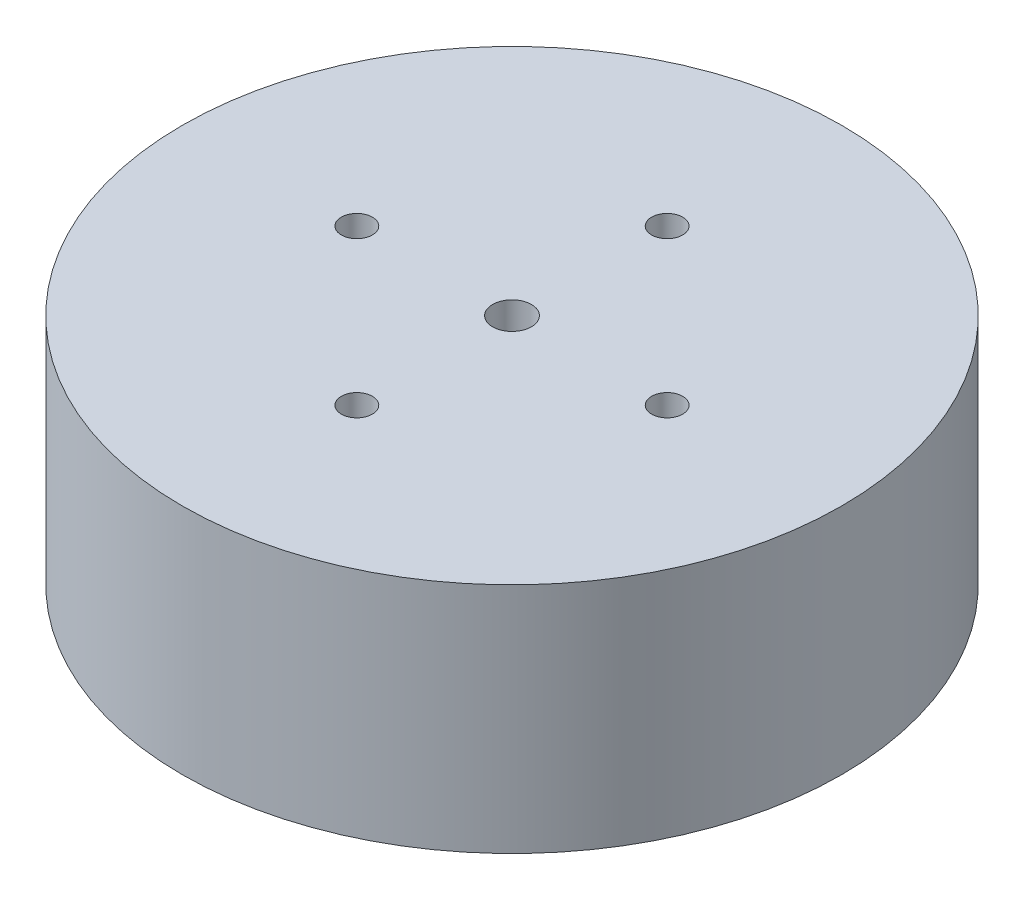
ISO-10303-21;
HEADER;
FILE_DESCRIPTION(('STEP AP214'),'2;1');
FILE_NAME('part.step','',(''),(''),'','','');
FILE_SCHEMA(('AUTOMOTIVE_DESIGN { 1 0 10303 214 1 1 1 1 }'));
ENDSEC;
DATA;
#1=APPLICATION_CONTEXT('core data for automotive mechanical design processes');
#2=APPLICATION_PROTOCOL_DEFINITION('international standard','automotive_design',2000,#1);
#3=PRODUCT_CONTEXT('',#1,'mechanical');
#4=PRODUCT('Part','Part','',(#3));
#5=PRODUCT_RELATED_PRODUCT_CATEGORY('part','',(#4));
#6=PRODUCT_DEFINITION_FORMATION('','',#4);
#7=PRODUCT_DEFINITION_CONTEXT('part definition',#1,'design');
#8=PRODUCT_DEFINITION('design','',#6,#7);
#9=PRODUCT_DEFINITION_SHAPE('','',#8);
#10=(LENGTH_UNIT() NAMED_UNIT(*) SI_UNIT(.MILLI.,.METRE.));
#11=(NAMED_UNIT(*) PLANE_ANGLE_UNIT() SI_UNIT($,.RADIAN.));
#12=(NAMED_UNIT(*) SI_UNIT($,.STERADIAN.) SOLID_ANGLE_UNIT());
#13=UNCERTAINTY_MEASURE_WITH_UNIT(LENGTH_MEASURE(1.E-05),#10,'distance_accuracy_value','');
#14=(GEOMETRIC_REPRESENTATION_CONTEXT(3) GLOBAL_UNCERTAINTY_ASSIGNED_CONTEXT((#13)) GLOBAL_UNIT_ASSIGNED_CONTEXT((#10,
#11,#12)) REPRESENTATION_CONTEXT('',''));
#15=CARTESIAN_POINT('',(0.,0.,0.));
#16=DIRECTION('',(0.,0.,1.));
#17=DIRECTION('',(1.,0.,0.));
#18=AXIS2_PLACEMENT_3D('',#15,#16,#17);
#19=CARTESIAN_POINT('',(0.,30.,0.));
#20=DIRECTION('',(0.,-1.,0.));
#21=DIRECTION('',(0.,0.,-1.));
#22=AXIS2_PLACEMENT_3D('',#19,#20,#21);
#23=CYLINDRICAL_SURFACE('',#22,42.5);
#24=CARTESIAN_POINT('',(0.,30.,0.));
#25=DIRECTION('',(0.,1.,0.));
#26=DIRECTION('',(0.,0.,1.));
#27=AXIS2_PLACEMENT_3D('',#24,#25,#26);
#28=CIRCLE('',#27,42.5);
#29=CARTESIAN_POINT('',(0.,30.,42.5));
#30=VERTEX_POINT('',#29);
#31=EDGE_CURVE('E10',#30,#30,#28,.T.);
#32=ORIENTED_EDGE('',*,*,#31,.F.);
#33=EDGE_LOOP('',(#32));
#34=FACE_BOUND('',#33,.T.);
#35=CARTESIAN_POINT('',(0.,0.,0.));
#36=DIRECTION('',(0.,1.,0.));
#37=DIRECTION('',(0.,0.,1.));
#38=AXIS2_PLACEMENT_3D('',#35,#36,#37);
#39=CIRCLE('',#38,42.5);
#40=CARTESIAN_POINT('',(0.,0.,42.5));
#41=VERTEX_POINT('',#40);
#42=EDGE_CURVE('E42',#41,#41,#39,.T.);
#43=ORIENTED_EDGE('',*,*,#42,.T.);
#44=EDGE_LOOP('',(#43));
#45=FACE_BOUND('',#44,.T.);
#46=ADVANCED_FACE('F39',(#34,#45),#23,.T.);
#47=CARTESIAN_POINT('',(0.,30.,0.));
#48=DIRECTION('',(0.,1.,0.));
#49=DIRECTION('',(0.,0.,1.));
#50=AXIS2_PLACEMENT_3D('',#47,#48,#49);
#51=PLANE('',#50);
#52=CARTESIAN_POINT('',(0.,30.,20.));
#53=DIRECTION('',(0.,-1.,0.));
#54=DIRECTION('',(0.,0.,-1.));
#55=AXIS2_PLACEMENT_3D('',#52,#53,#54);
#56=CIRCLE('',#55,2.);
#57=CARTESIAN_POINT('',(0.,30.,18.));
#58=VERTEX_POINT('',#57);
#59=EDGE_CURVE('E65',#58,#58,#56,.T.);
#60=ORIENTED_EDGE('',*,*,#59,.T.);
#61=EDGE_LOOP('',(#60));
#62=FACE_BOUND('',#61,.T.);
#63=CARTESIAN_POINT('',(-20.,30.,0.));
#64=DIRECTION('',(0.,-1.,0.));
#65=DIRECTION('',(0.,0.,-1.));
#66=AXIS2_PLACEMENT_3D('',#63,#64,#65);
#67=CIRCLE('',#66,2.);
#68=CARTESIAN_POINT('',(-20.,30.,-2.));
#69=VERTEX_POINT('',#68);
#70=EDGE_CURVE('E89',#69,#69,#67,.T.);
#71=ORIENTED_EDGE('',*,*,#70,.T.);
#72=EDGE_LOOP('',(#71));
#73=FACE_BOUND('',#72,.T.);
#74=CARTESIAN_POINT('',(0.,30.,-20.));
#75=DIRECTION('',(0.,-1.,0.));
#76=DIRECTION('',(0.,0.,-1.));
#77=AXIS2_PLACEMENT_3D('',#74,#75,#76);
#78=CIRCLE('',#77,2.);
#79=CARTESIAN_POINT('',(0.,30.,-22.));
#80=VERTEX_POINT('',#79);
#81=EDGE_CURVE('E81',#80,#80,#78,.T.);
#82=ORIENTED_EDGE('',*,*,#81,.T.);
#83=EDGE_LOOP('',(#82));
#84=FACE_BOUND('',#83,.T.);
#85=CARTESIAN_POINT('',(20.,30.,0.));
#86=DIRECTION('',(0.,-1.,0.));
#87=DIRECTION('',(0.,0.,-1.));
#88=AXIS2_PLACEMENT_3D('',#85,#86,#87);
#89=CIRCLE('',#88,2.);
#90=CARTESIAN_POINT('',(20.,30.,-2.));
#91=VERTEX_POINT('',#90);
#92=EDGE_CURVE('E73',#91,#91,#89,.T.);
#93=ORIENTED_EDGE('',*,*,#92,.T.);
#94=EDGE_LOOP('',(#93));
#95=FACE_BOUND('',#94,.T.);
#96=CARTESIAN_POINT('',(0.,30.,0.));
#97=DIRECTION('',(0.,1.,0.));
#98=DIRECTION('',(0.,0.,1.));
#99=AXIS2_PLACEMENT_3D('',#96,#97,#98);
#100=CIRCLE('',#99,2.5);
#101=CARTESIAN_POINT('',(0.,30.,2.5));
#102=VERTEX_POINT('',#101);
#103=EDGE_CURVE('E53',#102,#102,#100,.T.);
#104=ORIENTED_EDGE('',*,*,#103,.F.);
#105=EDGE_LOOP('',(#104));
#106=FACE_BOUND('',#105,.T.);
#107=ORIENTED_EDGE('',*,*,#31,.T.);
#108=EDGE_LOOP('',(#107));
#109=FACE_BOUND('',#108,.T.);
#110=ADVANCED_FACE('F101',(#62,#73,#84,#95,#106,#109),#51,.T.);
#111=CARTESIAN_POINT('',(0.,0.,0.));
#112=DIRECTION('',(0.,1.,0.));
#113=DIRECTION('',(0.,0.,1.));
#114=AXIS2_PLACEMENT_3D('',#111,#112,#113);
#115=PLANE('',#114);
#116=CARTESIAN_POINT('',(0.,0.,0.));
#117=DIRECTION('',(0.,-1.,0.));
#118=DIRECTION('',(0.,0.,-1.));
#119=AXIS2_PLACEMENT_3D('',#116,#117,#118);
#120=CIRCLE('',#119,27.5);
#121=CARTESIAN_POINT('',(0.,0.,-27.5));
#122=VERTEX_POINT('',#121);
#123=EDGE_CURVE('E61',#122,#122,#120,.T.);
#124=ORIENTED_EDGE('',*,*,#123,.F.);
#125=EDGE_LOOP('',(#124));
#126=FACE_BOUND('',#125,.T.);
#127=ORIENTED_EDGE('',*,*,#42,.F.);
#128=EDGE_LOOP('',(#127));
#129=FACE_BOUND('',#128,.T.);
#130=ADVANCED_FACE('F131',(#126,#129),#115,.F.);
#131=CARTESIAN_POINT('',(0.,20.,0.));
#132=DIRECTION('',(0.,1.,0.));
#133=DIRECTION('',(0.,0.,1.));
#134=AXIS2_PLACEMENT_3D('',#131,#132,#133);
#135=CYLINDRICAL_SURFACE('',#134,2.5);
#136=CARTESIAN_POINT('',(0.,20.,0.));
#137=DIRECTION('',(0.,1.,0.));
#138=DIRECTION('',(0.,0.,1.));
#139=AXIS2_PLACEMENT_3D('',#136,#137,#138);
#140=CIRCLE('',#139,2.5);
#141=CARTESIAN_POINT('',(0.,20.,2.5));
#142=VERTEX_POINT('',#141);
#143=EDGE_CURVE('E51',#142,#142,#140,.T.);
#144=ORIENTED_EDGE('',*,*,#143,.F.);
#145=EDGE_LOOP('',(#144));
#146=FACE_BOUND('',#145,.T.);
#147=ORIENTED_EDGE('',*,*,#103,.T.);
#148=EDGE_LOOP('',(#147));
#149=FACE_BOUND('',#148,.T.);
#150=ADVANCED_FACE('F134',(#146,#149),#135,.F.);
#151=CARTESIAN_POINT('',(0.,20.,0.));
#152=DIRECTION('',(0.,1.,0.));
#153=DIRECTION('',(0.,0.,1.));
#154=AXIS2_PLACEMENT_3D('',#151,#152,#153);
#155=PLANE('',#154);
#156=ORIENTED_EDGE('',*,*,#143,.T.);
#157=EDGE_LOOP('',(#156));
#158=FACE_BOUND('',#157,.T.);
#159=ADVANCED_FACE('F127',(#158),#155,.T.);
#160=CARTESIAN_POINT('',(0.,5.,0.));
#161=DIRECTION('',(0.,-1.,0.));
#162=DIRECTION('',(0.,0.,-1.));
#163=AXIS2_PLACEMENT_3D('',#160,#161,#162);
#164=CYLINDRICAL_SURFACE('',#163,27.5);
#165=CARTESIAN_POINT('',(0.,5.,0.));
#166=DIRECTION('',(0.,-1.,0.));
#167=DIRECTION('',(0.,0.,-1.));
#168=AXIS2_PLACEMENT_3D('',#165,#166,#167);
#169=CIRCLE('',#168,27.5);
#170=CARTESIAN_POINT('',(0.,5.,-27.5));
#171=VERTEX_POINT('',#170);
#172=EDGE_CURVE('E57',#171,#171,#169,.T.);
#173=ORIENTED_EDGE('',*,*,#172,.F.);
#174=EDGE_LOOP('',(#173));
#175=FACE_BOUND('',#174,.T.);
#176=ORIENTED_EDGE('',*,*,#123,.T.);
#177=EDGE_LOOP('',(#176));
#178=FACE_BOUND('',#177,.T.);
#179=ADVANCED_FACE('F115',(#175,#178),#164,.F.);
#180=CARTESIAN_POINT('',(0.,5.,0.));
#181=DIRECTION('',(0.,-1.,0.));
#182=DIRECTION('',(0.,0.,-1.));
#183=AXIS2_PLACEMENT_3D('',#180,#181,#182);
#184=PLANE('',#183);
#185=CARTESIAN_POINT('',(0.,5.,20.));
#186=DIRECTION('',(0.,-1.,0.));
#187=DIRECTION('',(0.,0.,-1.));
#188=AXIS2_PLACEMENT_3D('',#185,#186,#187);
#189=CIRCLE('',#188,2.);
#190=CARTESIAN_POINT('',(0.,5.,18.));
#191=VERTEX_POINT('',#190);
#192=EDGE_CURVE('E93',#191,#191,#189,.T.);
#193=ORIENTED_EDGE('',*,*,#192,.F.);
#194=EDGE_LOOP('',(#193));
#195=FACE_BOUND('',#194,.T.);
#196=CARTESIAN_POINT('',(-20.,5.,0.));
#197=DIRECTION('',(0.,-1.,0.));
#198=DIRECTION('',(0.,0.,-1.));
#199=AXIS2_PLACEMENT_3D('',#196,#197,#198);
#200=CIRCLE('',#199,2.);
#201=CARTESIAN_POINT('',(-20.,5.,-2.));
#202=VERTEX_POINT('',#201);
#203=EDGE_CURVE('E85',#202,#202,#200,.T.);
#204=ORIENTED_EDGE('',*,*,#203,.F.);
#205=EDGE_LOOP('',(#204));
#206=FACE_BOUND('',#205,.T.);
#207=CARTESIAN_POINT('',(0.,5.,-20.));
#208=DIRECTION('',(0.,-1.,0.));
#209=DIRECTION('',(0.,0.,-1.));
#210=AXIS2_PLACEMENT_3D('',#207,#208,#209);
#211=CIRCLE('',#210,2.);
#212=CARTESIAN_POINT('',(0.,5.,-22.));
#213=VERTEX_POINT('',#212);
#214=EDGE_CURVE('E77',#213,#213,#211,.T.);
#215=ORIENTED_EDGE('',*,*,#214,.F.);
#216=EDGE_LOOP('',(#215));
#217=FACE_BOUND('',#216,.T.);
#218=CARTESIAN_POINT('',(20.,5.,0.));
#219=DIRECTION('',(0.,-1.,0.));
#220=DIRECTION('',(0.,0.,-1.));
#221=AXIS2_PLACEMENT_3D('',#218,#219,#220);
#222=CIRCLE('',#221,2.);
#223=CARTESIAN_POINT('',(20.,5.,-2.));
#224=VERTEX_POINT('',#223);
#225=EDGE_CURVE('E69',#224,#224,#222,.T.);
#226=ORIENTED_EDGE('',*,*,#225,.F.);
#227=EDGE_LOOP('',(#226));
#228=FACE_BOUND('',#227,.T.);
#229=ORIENTED_EDGE('',*,*,#172,.T.);
#230=EDGE_LOOP('',(#229));
#231=FACE_BOUND('',#230,.T.);
#232=ADVANCED_FACE('F111',(#195,#206,#217,#228,#231),#184,.T.);
#233=CARTESIAN_POINT('',(20.,30.,0.));
#234=DIRECTION('',(0.,-1.,0.));
#235=DIRECTION('',(0.,0.,-1.));
#236=AXIS2_PLACEMENT_3D('',#233,#234,#235);
#237=CYLINDRICAL_SURFACE('',#236,2.);
#238=CARTESIAN_POINT('',(20.,30.,-2.));
#239=CARTESIAN_POINT('',(20.,29.7395833333333,-2.));
#240=CARTESIAN_POINT('',(20.,29.4791666666667,-2.));
#241=CARTESIAN_POINT('',(20.,28.9583333333333,-2.));
#242=CARTESIAN_POINT('',(20.,28.6979166666667,-2.));
#243=CARTESIAN_POINT('',(20.,28.1770833333333,-2.));
#244=CARTESIAN_POINT('',(20.,27.9166666666667,-2.));
#245=CARTESIAN_POINT('',(20.,27.3958333333333,-2.));
#246=CARTESIAN_POINT('',(20.,27.1354166666667,-2.));
#247=CARTESIAN_POINT('',(20.,26.6145833333333,-2.));
#248=CARTESIAN_POINT('',(20.,26.3541666666667,-2.));
#249=CARTESIAN_POINT('',(20.,25.8333333333333,-2.));
#250=CARTESIAN_POINT('',(20.,25.5729166666667,-2.));
#251=CARTESIAN_POINT('',(20.,25.0520833333333,-2.));
#252=CARTESIAN_POINT('',(20.,24.7916666666667,-2.));
#253=CARTESIAN_POINT('',(20.,24.2708333333333,-2.));
#254=CARTESIAN_POINT('',(20.,24.0104166666667,-2.));
#255=CARTESIAN_POINT('',(20.,23.4895833333333,-2.));
#256=CARTESIAN_POINT('',(20.,23.2291666666667,-2.));
#257=CARTESIAN_POINT('',(20.,22.7083333333333,-2.));
#258=CARTESIAN_POINT('',(20.,22.4479166666667,-2.));
#259=CARTESIAN_POINT('',(20.,21.9270833333333,-2.));
#260=CARTESIAN_POINT('',(20.,21.6666666666667,-2.));
#261=CARTESIAN_POINT('',(20.,21.1458333333333,-2.));
#262=CARTESIAN_POINT('',(20.,20.8854166666667,-2.));
#263=CARTESIAN_POINT('',(20.,20.3645833333333,-2.));
#264=CARTESIAN_POINT('',(20.,20.1041666666667,-2.));
#265=CARTESIAN_POINT('',(20.,19.5833333333333,-2.));
#266=CARTESIAN_POINT('',(20.,19.3229166666667,-2.));
#267=CARTESIAN_POINT('',(20.,18.8020833333333,-2.));
#268=CARTESIAN_POINT('',(20.,18.5416666666667,-2.));
#269=CARTESIAN_POINT('',(20.,18.0208333333333,-2.));
#270=CARTESIAN_POINT('',(20.,17.7604166666667,-2.));
#271=CARTESIAN_POINT('',(20.,17.2395833333333,-2.));
#272=CARTESIAN_POINT('',(20.,16.9791666666667,-2.));
#273=CARTESIAN_POINT('',(20.,16.4583333333333,-2.));
#274=CARTESIAN_POINT('',(20.,16.1979166666667,-2.));
#275=CARTESIAN_POINT('',(20.,15.6770833333333,-2.));
#276=CARTESIAN_POINT('',(20.,15.4166666666667,-2.));
#277=CARTESIAN_POINT('',(20.,14.8958333333333,-2.));
#278=CARTESIAN_POINT('',(20.,14.6354166666667,-2.));
#279=CARTESIAN_POINT('',(20.,14.1145833333333,-2.));
#280=CARTESIAN_POINT('',(20.,13.8541666666667,-2.));
#281=CARTESIAN_POINT('',(20.,13.3333333333333,-2.));
#282=CARTESIAN_POINT('',(20.,13.0729166666667,-2.));
#283=CARTESIAN_POINT('',(20.,12.5520833333333,-2.));
#284=CARTESIAN_POINT('',(20.,12.2916666666667,-2.));
#285=CARTESIAN_POINT('',(20.,11.7708333333333,-2.));
#286=CARTESIAN_POINT('',(20.,11.5104166666667,-2.));
#287=CARTESIAN_POINT('',(20.,10.9895833333333,-2.));
#288=CARTESIAN_POINT('',(20.,10.7291666666667,-2.));
#289=CARTESIAN_POINT('',(20.,10.2083333333333,-2.));
#290=CARTESIAN_POINT('',(20.,9.94791666666667,-2.));
#291=CARTESIAN_POINT('',(20.,9.42708333333333,-2.));
#292=CARTESIAN_POINT('',(20.,9.16666666666667,-2.));
#293=CARTESIAN_POINT('',(20.,8.64583333333333,-2.));
#294=CARTESIAN_POINT('',(20.,8.38541666666667,-2.));
#295=CARTESIAN_POINT('',(20.,7.86458333333333,-2.));
#296=CARTESIAN_POINT('',(20.,7.60416666666667,-2.));
#297=CARTESIAN_POINT('',(20.,7.08333333333333,-2.));
#298=CARTESIAN_POINT('',(20.,6.82291666666667,-2.));
#299=CARTESIAN_POINT('',(20.,6.30208333333334,-2.));
#300=CARTESIAN_POINT('',(20.,6.04166666666667,-2.));
#301=CARTESIAN_POINT('',(20.,5.52083333333333,-2.));
#302=CARTESIAN_POINT('',(20.,5.26041666666667,-2.));
#303=CARTESIAN_POINT('',(20.,5.,-2.));
#304=B_SPLINE_CURVE_WITH_KNOTS('',3,(#238,#239,#240,#241,#242,#243,#244,#245,#246,#247,#248,
#249,#250,#251,#252,#253,#254,#255,#256,#257,#258,#259,#260,#261,#262,#263,#264,#265,#266,#267,
#268,#269,#270,#271,#272,#273,#274,#275,#276,#277,#278,#279,#280,#281,#282,#283,#284,#285,#286,
#287,#288,#289,#290,#291,#292,#293,#294,#295,#296,#297,#298,#299,#300,#301,#302,#303),
.UNSPECIFIED.,.F.,.F.,(4,2,2,2,2,2,2,2,2,2,2,2,2,2,2,2,2,2,2,2,2,2,2,2,2,2,2,2,2,2,2,2,4),(0.,
0.781249999999997,1.5625,2.34375,3.125,3.90625,4.6875,5.46875,6.25,7.03125,7.8125,8.59375,9.375,
10.15625,10.9375,11.71875,12.5,13.28125,14.0625,14.84375,15.625,16.40625,17.1875,17.96875,18.75,
19.53125,20.3125,21.09375,21.875,22.65625,23.4375,24.21875,25.),.UNSPECIFIED.);
#305=EDGE_CURVE('BSEAM114',#91,#224,#304,.T.);
#306=ORIENTED_EDGE('',*,*,#92,.F.);
#307=ORIENTED_EDGE('',*,*,#225,.T.);
#308=ORIENTED_EDGE('',*,*,#305,.T.);
#309=ORIENTED_EDGE('',*,*,#305,.F.);
#310=EDGE_LOOP('',(#306,#308,#307,#309));
#311=FACE_BOUND('',#310,.T.);
#312=ADVANCED_FACE('F114',(#311),#237,.F.);
#313=CARTESIAN_POINT('',(0.,30.,-20.));
#314=DIRECTION('',(0.,-1.,0.));
#315=DIRECTION('',(0.,0.,-1.));
#316=AXIS2_PLACEMENT_3D('',#313,#314,#315);
#317=CYLINDRICAL_SURFACE('',#316,2.);
#318=CARTESIAN_POINT('',(0.,30.,-22.));
#319=CARTESIAN_POINT('',(0.,29.7395833333333,-22.));
#320=CARTESIAN_POINT('',(0.,29.4791666666667,-22.));
#321=CARTESIAN_POINT('',(0.,28.9583333333333,-22.));
#322=CARTESIAN_POINT('',(0.,28.6979166666667,-22.));
#323=CARTESIAN_POINT('',(0.,28.1770833333333,-22.));
#324=CARTESIAN_POINT('',(0.,27.9166666666667,-22.));
#325=CARTESIAN_POINT('',(0.,27.3958333333333,-22.));
#326=CARTESIAN_POINT('',(0.,27.1354166666667,-22.));
#327=CARTESIAN_POINT('',(0.,26.6145833333333,-22.));
#328=CARTESIAN_POINT('',(0.,26.3541666666667,-22.));
#329=CARTESIAN_POINT('',(0.,25.8333333333333,-22.));
#330=CARTESIAN_POINT('',(0.,25.5729166666667,-22.));
#331=CARTESIAN_POINT('',(0.,25.0520833333333,-22.));
#332=CARTESIAN_POINT('',(0.,24.7916666666667,-22.));
#333=CARTESIAN_POINT('',(0.,24.2708333333333,-22.));
#334=CARTESIAN_POINT('',(0.,24.0104166666667,-22.));
#335=CARTESIAN_POINT('',(0.,23.4895833333333,-22.));
#336=CARTESIAN_POINT('',(0.,23.2291666666667,-22.));
#337=CARTESIAN_POINT('',(0.,22.7083333333333,-22.));
#338=CARTESIAN_POINT('',(0.,22.4479166666667,-22.));
#339=CARTESIAN_POINT('',(0.,21.9270833333333,-22.));
#340=CARTESIAN_POINT('',(0.,21.6666666666667,-22.));
#341=CARTESIAN_POINT('',(0.,21.1458333333333,-22.));
#342=CARTESIAN_POINT('',(0.,20.8854166666667,-22.));
#343=CARTESIAN_POINT('',(0.,20.3645833333333,-22.));
#344=CARTESIAN_POINT('',(0.,20.1041666666667,-22.));
#345=CARTESIAN_POINT('',(0.,19.5833333333333,-22.));
#346=CARTESIAN_POINT('',(0.,19.3229166666667,-22.));
#347=CARTESIAN_POINT('',(0.,18.8020833333333,-22.));
#348=CARTESIAN_POINT('',(0.,18.5416666666667,-22.));
#349=CARTESIAN_POINT('',(0.,18.0208333333333,-22.));
#350=CARTESIAN_POINT('',(0.,17.7604166666667,-22.));
#351=CARTESIAN_POINT('',(0.,17.2395833333333,-22.));
#352=CARTESIAN_POINT('',(0.,16.9791666666667,-22.));
#353=CARTESIAN_POINT('',(0.,16.4583333333333,-22.));
#354=CARTESIAN_POINT('',(0.,16.1979166666667,-22.));
#355=CARTESIAN_POINT('',(0.,15.6770833333333,-22.));
#356=CARTESIAN_POINT('',(0.,15.4166666666667,-22.));
#357=CARTESIAN_POINT('',(0.,14.8958333333333,-22.));
#358=CARTESIAN_POINT('',(0.,14.6354166666667,-22.));
#359=CARTESIAN_POINT('',(0.,14.1145833333333,-22.));
#360=CARTESIAN_POINT('',(0.,13.8541666666667,-22.));
#361=CARTESIAN_POINT('',(0.,13.3333333333333,-22.));
#362=CARTESIAN_POINT('',(0.,13.0729166666667,-22.));
#363=CARTESIAN_POINT('',(0.,12.5520833333333,-22.));
#364=CARTESIAN_POINT('',(0.,12.2916666666667,-22.));
#365=CARTESIAN_POINT('',(0.,11.7708333333333,-22.));
#366=CARTESIAN_POINT('',(0.,11.5104166666667,-22.));
#367=CARTESIAN_POINT('',(0.,10.9895833333333,-22.));
#368=CARTESIAN_POINT('',(0.,10.7291666666667,-22.));
#369=CARTESIAN_POINT('',(0.,10.2083333333333,-22.));
#370=CARTESIAN_POINT('',(0.,9.94791666666667,-22.));
#371=CARTESIAN_POINT('',(0.,9.42708333333333,-22.));
#372=CARTESIAN_POINT('',(0.,9.16666666666667,-22.));
#373=CARTESIAN_POINT('',(0.,8.64583333333333,-22.));
#374=CARTESIAN_POINT('',(0.,8.38541666666667,-22.));
#375=CARTESIAN_POINT('',(0.,7.86458333333333,-22.));
#376=CARTESIAN_POINT('',(0.,7.60416666666667,-22.));
#377=CARTESIAN_POINT('',(0.,7.08333333333333,-22.));
#378=CARTESIAN_POINT('',(0.,6.82291666666667,-22.));
#379=CARTESIAN_POINT('',(0.,6.30208333333334,-22.));
#380=CARTESIAN_POINT('',(0.,6.04166666666667,-22.));
#381=CARTESIAN_POINT('',(0.,5.52083333333333,-22.));
#382=CARTESIAN_POINT('',(0.,5.26041666666667,-22.));
#383=CARTESIAN_POINT('',(0.,5.,-22.));
#384=B_SPLINE_CURVE_WITH_KNOTS('',3,(#318,#319,#320,#321,#322,#323,#324,#325,#326,#327,#328,
#329,#330,#331,#332,#333,#334,#335,#336,#337,#338,#339,#340,#341,#342,#343,#344,#345,#346,#347,
#348,#349,#350,#351,#352,#353,#354,#355,#356,#357,#358,#359,#360,#361,#362,#363,#364,#365,#366,
#367,#368,#369,#370,#371,#372,#373,#374,#375,#376,#377,#378,#379,#380,#381,#382,#383),
.UNSPECIFIED.,.F.,.F.,(4,2,2,2,2,2,2,2,2,2,2,2,2,2,2,2,2,2,2,2,2,2,2,2,2,2,2,2,2,2,2,2,4),(0.,
0.781249999999997,1.5625,2.34375,3.125,3.90625,4.6875,5.46875,6.25,7.03125,7.8125,8.59375,9.375,
10.15625,10.9375,11.71875,12.5,13.28125,14.0625,14.84375,15.625,16.40625,17.1875,17.96875,18.75,
19.53125,20.3125,21.09375,21.875,22.65625,23.4375,24.21875,25.),.UNSPECIFIED.);
#385=EDGE_CURVE('BSEAM154',#80,#213,#384,.T.);
#386=ORIENTED_EDGE('',*,*,#81,.F.);
#387=ORIENTED_EDGE('',*,*,#214,.T.);
#388=ORIENTED_EDGE('',*,*,#385,.T.);
#389=ORIENTED_EDGE('',*,*,#385,.F.);
#390=EDGE_LOOP('',(#386,#388,#387,#389));
#391=FACE_BOUND('',#390,.T.);
#392=ADVANCED_FACE('F154',(#391),#317,.F.);
#393=CARTESIAN_POINT('',(-20.,30.,0.));
#394=DIRECTION('',(0.,-1.,0.));
#395=DIRECTION('',(0.,0.,-1.));
#396=AXIS2_PLACEMENT_3D('',#393,#394,#395);
#397=CYLINDRICAL_SURFACE('',#396,2.);
#398=CARTESIAN_POINT('',(-20.,30.,-2.));
#399=CARTESIAN_POINT('',(-20.,29.7395833333333,-2.));
#400=CARTESIAN_POINT('',(-20.,29.4791666666667,-2.));
#401=CARTESIAN_POINT('',(-20.,28.9583333333333,-2.));
#402=CARTESIAN_POINT('',(-20.,28.6979166666667,-2.));
#403=CARTESIAN_POINT('',(-20.,28.1770833333333,-2.));
#404=CARTESIAN_POINT('',(-20.,27.9166666666667,-2.));
#405=CARTESIAN_POINT('',(-20.,27.3958333333333,-2.));
#406=CARTESIAN_POINT('',(-20.,27.1354166666667,-2.));
#407=CARTESIAN_POINT('',(-20.,26.6145833333333,-2.));
#408=CARTESIAN_POINT('',(-20.,26.3541666666667,-2.));
#409=CARTESIAN_POINT('',(-20.,25.8333333333333,-2.));
#410=CARTESIAN_POINT('',(-20.,25.5729166666667,-2.));
#411=CARTESIAN_POINT('',(-20.,25.0520833333333,-2.));
#412=CARTESIAN_POINT('',(-20.,24.7916666666667,-2.));
#413=CARTESIAN_POINT('',(-20.,24.2708333333333,-2.));
#414=CARTESIAN_POINT('',(-20.,24.0104166666667,-2.));
#415=CARTESIAN_POINT('',(-20.,23.4895833333333,-2.));
#416=CARTESIAN_POINT('',(-20.,23.2291666666667,-2.));
#417=CARTESIAN_POINT('',(-20.,22.7083333333333,-2.));
#418=CARTESIAN_POINT('',(-20.,22.4479166666667,-2.));
#419=CARTESIAN_POINT('',(-20.,21.9270833333333,-2.));
#420=CARTESIAN_POINT('',(-20.,21.6666666666667,-2.));
#421=CARTESIAN_POINT('',(-20.,21.1458333333333,-2.));
#422=CARTESIAN_POINT('',(-20.,20.8854166666667,-2.));
#423=CARTESIAN_POINT('',(-20.,20.3645833333333,-2.));
#424=CARTESIAN_POINT('',(-20.,20.1041666666667,-2.));
#425=CARTESIAN_POINT('',(-20.,19.5833333333333,-2.));
#426=CARTESIAN_POINT('',(-20.,19.3229166666667,-2.));
#427=CARTESIAN_POINT('',(-20.,18.8020833333333,-2.));
#428=CARTESIAN_POINT('',(-20.,18.5416666666667,-2.));
#429=CARTESIAN_POINT('',(-20.,18.0208333333333,-2.));
#430=CARTESIAN_POINT('',(-20.,17.7604166666667,-2.));
#431=CARTESIAN_POINT('',(-20.,17.2395833333333,-2.));
#432=CARTESIAN_POINT('',(-20.,16.9791666666667,-2.));
#433=CARTESIAN_POINT('',(-20.,16.4583333333333,-2.));
#434=CARTESIAN_POINT('',(-20.,16.1979166666667,-2.));
#435=CARTESIAN_POINT('',(-20.,15.6770833333333,-2.));
#436=CARTESIAN_POINT('',(-20.,15.4166666666667,-2.));
#437=CARTESIAN_POINT('',(-20.,14.8958333333333,-2.));
#438=CARTESIAN_POINT('',(-20.,14.6354166666667,-2.));
#439=CARTESIAN_POINT('',(-20.,14.1145833333333,-2.));
#440=CARTESIAN_POINT('',(-20.,13.8541666666667,-2.));
#441=CARTESIAN_POINT('',(-20.,13.3333333333333,-2.));
#442=CARTESIAN_POINT('',(-20.,13.0729166666667,-2.));
#443=CARTESIAN_POINT('',(-20.,12.5520833333333,-2.));
#444=CARTESIAN_POINT('',(-20.,12.2916666666667,-2.));
#445=CARTESIAN_POINT('',(-20.,11.7708333333333,-2.));
#446=CARTESIAN_POINT('',(-20.,11.5104166666667,-2.));
#447=CARTESIAN_POINT('',(-20.,10.9895833333333,-2.));
#448=CARTESIAN_POINT('',(-20.,10.7291666666667,-2.));
#449=CARTESIAN_POINT('',(-20.,10.2083333333333,-2.));
#450=CARTESIAN_POINT('',(-20.,9.94791666666667,-2.));
#451=CARTESIAN_POINT('',(-20.,9.42708333333333,-2.));
#452=CARTESIAN_POINT('',(-20.,9.16666666666667,-2.));
#453=CARTESIAN_POINT('',(-20.,8.64583333333333,-2.));
#454=CARTESIAN_POINT('',(-20.,8.38541666666667,-2.));
#455=CARTESIAN_POINT('',(-20.,7.86458333333333,-2.));
#456=CARTESIAN_POINT('',(-20.,7.60416666666667,-2.));
#457=CARTESIAN_POINT('',(-20.,7.08333333333333,-2.));
#458=CARTESIAN_POINT('',(-20.,6.82291666666667,-2.));
#459=CARTESIAN_POINT('',(-20.,6.30208333333334,-2.));
#460=CARTESIAN_POINT('',(-20.,6.04166666666667,-2.));
#461=CARTESIAN_POINT('',(-20.,5.52083333333333,-2.));
#462=CARTESIAN_POINT('',(-20.,5.26041666666667,-2.));
#463=CARTESIAN_POINT('',(-20.,5.,-2.));
#464=B_SPLINE_CURVE_WITH_KNOTS('',3,(#398,#399,#400,#401,#402,#403,#404,#405,#406,#407,#408,
#409,#410,#411,#412,#413,#414,#415,#416,#417,#418,#419,#420,#421,#422,#423,#424,#425,#426,#427,
#428,#429,#430,#431,#432,#433,#434,#435,#436,#437,#438,#439,#440,#441,#442,#443,#444,#445,#446,
#447,#448,#449,#450,#451,#452,#453,#454,#455,#456,#457,#458,#459,#460,#461,#462,#463),
.UNSPECIFIED.,.F.,.F.,(4,2,2,2,2,2,2,2,2,2,2,2,2,2,2,2,2,2,2,2,2,2,2,2,2,2,2,2,2,2,2,2,4),(0.,
0.781249999999997,1.5625,2.34375,3.125,3.90625,4.6875,5.46875,6.25,7.03125,7.8125,8.59375,9.375,
10.15625,10.9375,11.71875,12.5,13.28125,14.0625,14.84375,15.625,16.40625,17.1875,17.96875,18.75,
19.53125,20.3125,21.09375,21.875,22.65625,23.4375,24.21875,25.),.UNSPECIFIED.);
#465=EDGE_CURVE('BSEAM107',#69,#202,#464,.T.);
#466=ORIENTED_EDGE('',*,*,#70,.F.);
#467=ORIENTED_EDGE('',*,*,#203,.T.);
#468=ORIENTED_EDGE('',*,*,#465,.T.);
#469=ORIENTED_EDGE('',*,*,#465,.F.);
#470=EDGE_LOOP('',(#466,#468,#467,#469));
#471=FACE_BOUND('',#470,.T.);
#472=ADVANCED_FACE('F107',(#471),#397,.F.);
#473=CARTESIAN_POINT('',(0.,30.,20.));
#474=DIRECTION('',(0.,-1.,0.));
#475=DIRECTION('',(0.,0.,-1.));
#476=AXIS2_PLACEMENT_3D('',#473,#474,#475);
#477=CYLINDRICAL_SURFACE('',#476,2.);
#478=CARTESIAN_POINT('',(0.,30.,18.));
#479=CARTESIAN_POINT('',(0.,29.7395833333333,18.));
#480=CARTESIAN_POINT('',(0.,29.4791666666667,18.));
#481=CARTESIAN_POINT('',(0.,28.9583333333333,18.));
#482=CARTESIAN_POINT('',(0.,28.6979166666667,18.));
#483=CARTESIAN_POINT('',(0.,28.1770833333333,18.));
#484=CARTESIAN_POINT('',(0.,27.9166666666667,18.));
#485=CARTESIAN_POINT('',(0.,27.3958333333333,18.));
#486=CARTESIAN_POINT('',(0.,27.1354166666667,18.));
#487=CARTESIAN_POINT('',(0.,26.6145833333333,18.));
#488=CARTESIAN_POINT('',(0.,26.3541666666667,18.));
#489=CARTESIAN_POINT('',(0.,25.8333333333333,18.));
#490=CARTESIAN_POINT('',(0.,25.5729166666667,18.));
#491=CARTESIAN_POINT('',(0.,25.0520833333333,18.));
#492=CARTESIAN_POINT('',(0.,24.7916666666667,18.));
#493=CARTESIAN_POINT('',(0.,24.2708333333333,18.));
#494=CARTESIAN_POINT('',(0.,24.0104166666667,18.));
#495=CARTESIAN_POINT('',(0.,23.4895833333333,18.));
#496=CARTESIAN_POINT('',(0.,23.2291666666667,18.));
#497=CARTESIAN_POINT('',(0.,22.7083333333333,18.));
#498=CARTESIAN_POINT('',(0.,22.4479166666667,18.));
#499=CARTESIAN_POINT('',(0.,21.9270833333333,18.));
#500=CARTESIAN_POINT('',(0.,21.6666666666667,18.));
#501=CARTESIAN_POINT('',(0.,21.1458333333333,18.));
#502=CARTESIAN_POINT('',(0.,20.8854166666667,18.));
#503=CARTESIAN_POINT('',(0.,20.3645833333333,18.));
#504=CARTESIAN_POINT('',(0.,20.1041666666667,18.));
#505=CARTESIAN_POINT('',(0.,19.5833333333333,18.));
#506=CARTESIAN_POINT('',(0.,19.3229166666667,18.));
#507=CARTESIAN_POINT('',(0.,18.8020833333333,18.));
#508=CARTESIAN_POINT('',(0.,18.5416666666667,18.));
#509=CARTESIAN_POINT('',(0.,18.0208333333333,18.));
#510=CARTESIAN_POINT('',(0.,17.7604166666667,18.));
#511=CARTESIAN_POINT('',(0.,17.2395833333333,18.));
#512=CARTESIAN_POINT('',(0.,16.9791666666667,18.));
#513=CARTESIAN_POINT('',(0.,16.4583333333333,18.));
#514=CARTESIAN_POINT('',(0.,16.1979166666667,18.));
#515=CARTESIAN_POINT('',(0.,15.6770833333333,18.));
#516=CARTESIAN_POINT('',(0.,15.4166666666667,18.));
#517=CARTESIAN_POINT('',(0.,14.8958333333333,18.));
#518=CARTESIAN_POINT('',(0.,14.6354166666667,18.));
#519=CARTESIAN_POINT('',(0.,14.1145833333333,18.));
#520=CARTESIAN_POINT('',(0.,13.8541666666667,18.));
#521=CARTESIAN_POINT('',(0.,13.3333333333333,18.));
#522=CARTESIAN_POINT('',(0.,13.0729166666667,18.));
#523=CARTESIAN_POINT('',(0.,12.5520833333333,18.));
#524=CARTESIAN_POINT('',(0.,12.2916666666667,18.));
#525=CARTESIAN_POINT('',(0.,11.7708333333333,18.));
#526=CARTESIAN_POINT('',(0.,11.5104166666667,18.));
#527=CARTESIAN_POINT('',(0.,10.9895833333333,18.));
#528=CARTESIAN_POINT('',(0.,10.7291666666667,18.));
#529=CARTESIAN_POINT('',(0.,10.2083333333333,18.));
#530=CARTESIAN_POINT('',(0.,9.94791666666667,18.));
#531=CARTESIAN_POINT('',(0.,9.42708333333333,18.));
#532=CARTESIAN_POINT('',(0.,9.16666666666667,18.));
#533=CARTESIAN_POINT('',(0.,8.64583333333333,18.));
#534=CARTESIAN_POINT('',(0.,8.38541666666667,18.));
#535=CARTESIAN_POINT('',(0.,7.86458333333333,18.));
#536=CARTESIAN_POINT('',(0.,7.60416666666667,18.));
#537=CARTESIAN_POINT('',(0.,7.08333333333333,18.));
#538=CARTESIAN_POINT('',(0.,6.82291666666667,18.));
#539=CARTESIAN_POINT('',(0.,6.30208333333334,18.));
#540=CARTESIAN_POINT('',(0.,6.04166666666667,18.));
#541=CARTESIAN_POINT('',(0.,5.52083333333333,18.));
#542=CARTESIAN_POINT('',(0.,5.26041666666667,18.));
#543=CARTESIAN_POINT('',(0.,5.,18.));
#544=B_SPLINE_CURVE_WITH_KNOTS('',3,(#478,#479,#480,#481,#482,#483,#484,#485,#486,#487,#488,
#489,#490,#491,#492,#493,#494,#495,#496,#497,#498,#499,#500,#501,#502,#503,#504,#505,#506,#507,
#508,#509,#510,#511,#512,#513,#514,#515,#516,#517,#518,#519,#520,#521,#522,#523,#524,#525,#526,
#527,#528,#529,#530,#531,#532,#533,#534,#535,#536,#537,#538,#539,#540,#541,#542,#543),
.UNSPECIFIED.,.F.,.F.,(4,2,2,2,2,2,2,2,2,2,2,2,2,2,2,2,2,2,2,2,2,2,2,2,2,2,2,2,2,2,2,2,4),(0.,
0.781249999999997,1.5625,2.34375,3.125,3.90625,4.6875,5.46875,6.25,7.03125,7.8125,8.59375,9.375,
10.15625,10.9375,11.71875,12.5,13.28125,14.0625,14.84375,15.625,16.40625,17.1875,17.96875,18.75,
19.53125,20.3125,21.09375,21.875,22.65625,23.4375,24.21875,25.),.UNSPECIFIED.);
#545=EDGE_CURVE('BSEAM104',#58,#191,#544,.T.);
#546=ORIENTED_EDGE('',*,*,#59,.F.);
#547=ORIENTED_EDGE('',*,*,#192,.T.);
#548=ORIENTED_EDGE('',*,*,#545,.T.);
#549=ORIENTED_EDGE('',*,*,#545,.F.);
#550=EDGE_LOOP('',(#546,#548,#547,#549));
#551=FACE_BOUND('',#550,.T.);
#552=ADVANCED_FACE('F104',(#551),#477,.F.);
#553=CLOSED_SHELL('',(#46,#110,#130,#150,#159,#179,#232,#312,#392,#472,#552));
#554=MANIFOLD_SOLID_BREP('B2',#553);
#555=ADVANCED_BREP_SHAPE_REPRESENTATION('',(#18,#554),#14);
#556=SHAPE_DEFINITION_REPRESENTATION(#9,#555);
ENDSEC;
END-ISO-10303-21;
